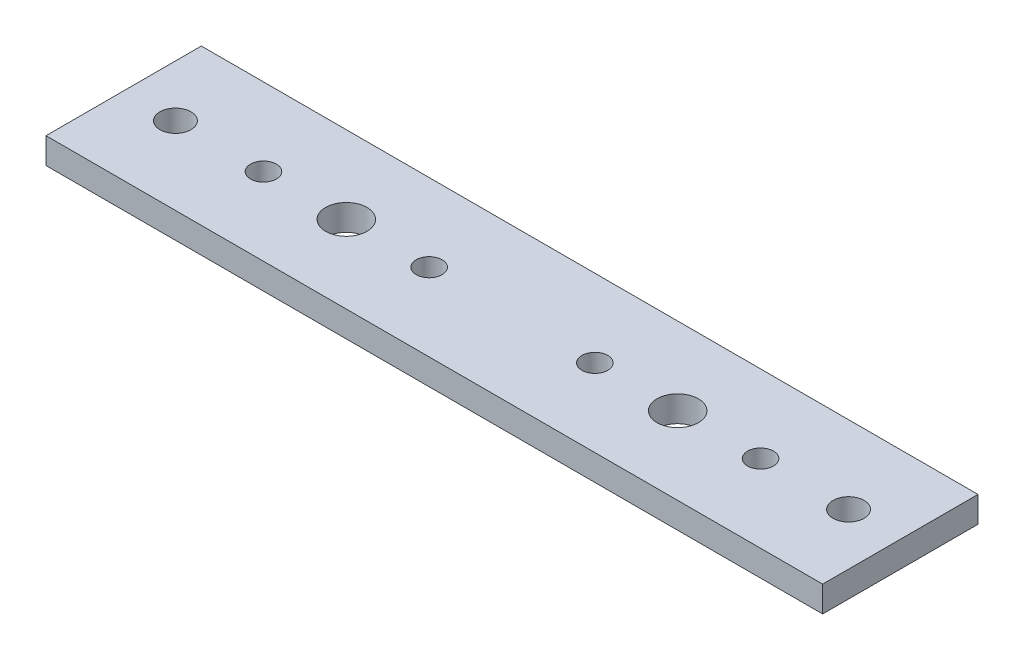
ISO-10303-21;
HEADER;
FILE_DESCRIPTION(('STEP AP214'),'2;1');
FILE_NAME('part.step','',(''),(''),'','','');
FILE_SCHEMA(('AUTOMOTIVE_DESIGN { 1 0 10303 214 1 1 1 1 }'));
ENDSEC;
DATA;
#1=APPLICATION_CONTEXT('core data for automotive mechanical design processes');
#2=APPLICATION_PROTOCOL_DEFINITION('international standard','automotive_design',2000,#1);
#3=PRODUCT_CONTEXT('',#1,'mechanical');
#4=PRODUCT('Part','Part','',(#3));
#5=PRODUCT_RELATED_PRODUCT_CATEGORY('part','',(#4));
#6=PRODUCT_DEFINITION_FORMATION('','',#4);
#7=PRODUCT_DEFINITION_CONTEXT('part definition',#1,'design');
#8=PRODUCT_DEFINITION('design','',#6,#7);
#9=PRODUCT_DEFINITION_SHAPE('','',#8);
#10=(LENGTH_UNIT() NAMED_UNIT(*) SI_UNIT(.MILLI.,.METRE.));
#11=(NAMED_UNIT(*) PLANE_ANGLE_UNIT() SI_UNIT($,.RADIAN.));
#12=(NAMED_UNIT(*) SI_UNIT($,.STERADIAN.) SOLID_ANGLE_UNIT());
#13=UNCERTAINTY_MEASURE_WITH_UNIT(LENGTH_MEASURE(1.E-05),#10,'distance_accuracy_value','');
#14=(GEOMETRIC_REPRESENTATION_CONTEXT(3) GLOBAL_UNCERTAINTY_ASSIGNED_CONTEXT((#13)) GLOBAL_UNIT_ASSIGNED_CONTEXT((#10,
#11,#12)) REPRESENTATION_CONTEXT('',''));
#15=CARTESIAN_POINT('',(0.,0.,0.));
#16=DIRECTION('',(0.,0.,1.));
#17=DIRECTION('',(1.,0.,0.));
#18=AXIS2_PLACEMENT_3D('',#15,#16,#17);
#19=CARTESIAN_POINT('',(0.,5.,0.));
#20=DIRECTION('',(0.,1.,0.));
#21=DIRECTION('',(0.,0.,1.));
#22=AXIS2_PLACEMENT_3D('',#19,#20,#21);
#23=PLANE('',#22);
#24=CARTESIAN_POINT('',(13.0686224444305,5.,-26.2271286165447));
#25=DIRECTION('',(0.,1.,0.));
#26=DIRECTION('',(0.,0.,-1.));
#27=AXIS2_PLACEMENT_3D('',#24,#25,#26);
#28=CIRCLE('',#27,4.);
#29=CARTESIAN_POINT('',(13.0686224444305,5.,-30.2271286165447));
#30=VERTEX_POINT('',#29);
#31=EDGE_CURVE('E145',#30,#30,#28,.T.);
#32=ORIENTED_EDGE('',*,*,#31,.F.);
#33=EDGE_LOOP('',(#32));
#34=FACE_BOUND('',#33,.T.);
#35=CARTESIAN_POINT('',(-66.9313775555696,5.,-26.2271286165446));
#36=DIRECTION('',(0.,1.,0.));
#37=DIRECTION('',(0.,0.,1.));
#38=AXIS2_PLACEMENT_3D('',#35,#36,#37);
#39=CIRCLE('',#38,2.5);
#40=CARTESIAN_POINT('',(-66.9313775555696,5.,-23.7271286165447));
#41=VERTEX_POINT('',#40);
#42=EDGE_CURVE('E133',#41,#41,#39,.T.);
#43=ORIENTED_EDGE('',*,*,#42,.F.);
#44=EDGE_LOOP('',(#43));
#45=FACE_BOUND('',#44,.T.);
#46=CARTESIAN_POINT('',(-50.9313775555695,5.,-26.2271286165446));
#47=DIRECTION('',(0.,1.,0.));
#48=DIRECTION('',(0.,0.,1.));
#49=AXIS2_PLACEMENT_3D('',#46,#47,#48);
#50=CIRCLE('',#49,4.00000000000001);
#51=CARTESIAN_POINT('',(-50.9313775555695,5.,-22.2271286165446));
#52=VERTEX_POINT('',#51);
#53=EDGE_CURVE('E121',#52,#52,#50,.T.);
#54=ORIENTED_EDGE('',*,*,#53,.F.);
#55=EDGE_LOOP('',(#54));
#56=FACE_BOUND('',#55,.T.);
#57=CARTESIAN_POINT('',(-83.9313775555696,5.,-26.2271286165446));
#58=DIRECTION('',(0.,1.,0.));
#59=DIRECTION('',(0.,0.,1.));
#60=AXIS2_PLACEMENT_3D('',#57,#58,#59);
#61=CIRCLE('',#60,3.00000000000001);
#62=CARTESIAN_POINT('',(-83.9313775555696,5.,-23.2271286165446));
#63=VERTEX_POINT('',#62);
#64=EDGE_CURVE('E100',#63,#63,#61,.T.);
#65=ORIENTED_EDGE('',*,*,#64,.F.);
#66=EDGE_LOOP('',(#65));
#67=FACE_BOUND('',#66,.T.);
#68=DIRECTION('',(0.,0.,1.));
#69=VECTOR('',#68,1.);
#70=CARTESIAN_POINT('',(-93.9313775555695,5.,-41.2271286165446));
#71=LINE('',#70,#69);
#72=CARTESIAN_POINT('',(-93.9313775555695,5.,-41.2271286165446));
#73=VERTEX_POINT('',#72);
#74=CARTESIAN_POINT('',(-93.9313775555695,5.,-11.2271286165446));
#75=VERTEX_POINT('',#74);
#76=EDGE_CURVE('E85',#73,#75,#71,.T.);
#77=ORIENTED_EDGE('',*,*,#76,.T.);
#78=DIRECTION('',(1.,0.,0.));
#79=VECTOR('',#78,1.);
#80=CARTESIAN_POINT('',(-93.9313775555695,5.,-11.2271286165446));
#81=LINE('',#80,#79);
#82=CARTESIAN_POINT('',(56.0686224444305,5.,-11.2271286165446));
#83=VERTEX_POINT('',#82);
#84=EDGE_CURVE('E80',#75,#83,#81,.T.);
#85=ORIENTED_EDGE('',*,*,#84,.T.);
#86=DIRECTION('',(0.,0.,-1.));
#87=VECTOR('',#86,1.);
#88=CARTESIAN_POINT('',(56.0686224444304,5.,-41.2271286165446));
#89=LINE('',#88,#87);
#90=CARTESIAN_POINT('',(56.0686224444304,5.,-41.2271286165446));
#91=VERTEX_POINT('',#90);
#92=EDGE_CURVE('E83',#83,#91,#89,.T.);
#93=ORIENTED_EDGE('',*,*,#92,.T.);
#94=DIRECTION('',(-1.,0.,0.));
#95=VECTOR('',#94,1.);
#96=CARTESIAN_POINT('',(-93.9313775555695,5.,-41.2271286165446));
#97=LINE('',#96,#95);
#98=EDGE_CURVE('E50',#91,#73,#97,.T.);
#99=ORIENTED_EDGE('',*,*,#98,.T.);
#100=EDGE_LOOP('',(#77,#85,#93,#99));
#101=FACE_BOUND('',#100,.T.);
#102=CARTESIAN_POINT('',(46.0686224444305,5.,-26.2271286165447));
#103=DIRECTION('',(0.,1.,0.));
#104=DIRECTION('',(0.,0.,-1.));
#105=AXIS2_PLACEMENT_3D('',#102,#103,#104);
#106=CIRCLE('',#105,2.99999999999999);
#107=CARTESIAN_POINT('',(46.0686224444305,5.,-29.2271286165447));
#108=VERTEX_POINT('',#107);
#109=EDGE_CURVE('E115',#108,#108,#106,.T.);
#110=ORIENTED_EDGE('',*,*,#109,.F.);
#111=EDGE_LOOP('',(#110));
#112=FACE_BOUND('',#111,.T.);
#113=CARTESIAN_POINT('',(-34.9313775555695,5.,-26.2271286165446));
#114=DIRECTION('',(0.,1.,0.));
#115=DIRECTION('',(0.,0.,1.));
#116=AXIS2_PLACEMENT_3D('',#113,#114,#115);
#117=CIRCLE('',#116,2.5);
#118=CARTESIAN_POINT('',(-34.9313775555695,5.,-23.7271286165446));
#119=VERTEX_POINT('',#118);
#120=EDGE_CURVE('E127',#119,#119,#117,.T.);
#121=ORIENTED_EDGE('',*,*,#120,.F.);
#122=EDGE_LOOP('',(#121));
#123=FACE_BOUND('',#122,.T.);
#124=CARTESIAN_POINT('',(-2.93137755556954,5.,-26.2271286165447));
#125=DIRECTION('',(0.,1.,0.));
#126=DIRECTION('',(0.,0.,-1.));
#127=AXIS2_PLACEMENT_3D('',#124,#125,#126);
#128=CIRCLE('',#127,2.5);
#129=CARTESIAN_POINT('',(-2.93137755556954,5.,-28.7271286165447));
#130=VERTEX_POINT('',#129);
#131=EDGE_CURVE('E139',#130,#130,#128,.T.);
#132=ORIENTED_EDGE('',*,*,#131,.F.);
#133=EDGE_LOOP('',(#132));
#134=FACE_BOUND('',#133,.T.);
#135=CARTESIAN_POINT('',(29.0686224444305,5.,-26.2271286165447));
#136=DIRECTION('',(0.,1.,0.));
#137=DIRECTION('',(0.,0.,-1.));
#138=AXIS2_PLACEMENT_3D('',#135,#136,#137);
#139=CIRCLE('',#138,2.49999999999999);
#140=CARTESIAN_POINT('',(29.0686224444305,5.,-28.7271286165447));
#141=VERTEX_POINT('',#140);
#142=EDGE_CURVE('E151',#141,#141,#139,.T.);
#143=ORIENTED_EDGE('',*,*,#142,.F.);
#144=EDGE_LOOP('',(#143));
#145=FACE_BOUND('',#144,.T.);
#146=ADVANCED_FACE('F33',(#34,#45,#56,#67,#101,#112,#123,#134,#145),#23,.T.);
#147=CARTESIAN_POINT('',(0.,0.,0.));
#148=DIRECTION('',(0.,1.,0.));
#149=DIRECTION('',(0.,0.,1.));
#150=AXIS2_PLACEMENT_3D('',#147,#148,#149);
#151=PLANE('',#150);
#152=DIRECTION('',(0.,0.,1.));
#153=VECTOR('',#152,1.);
#154=CARTESIAN_POINT('',(-93.9313775555695,0.,-41.2271286165446));
#155=LINE('',#154,#153);
#156=CARTESIAN_POINT('',(-93.9313775555695,0.,-41.2271286165446));
#157=VERTEX_POINT('',#156);
#158=CARTESIAN_POINT('',(-93.9313775555695,0.,-11.2271286165446));
#159=VERTEX_POINT('',#158);
#160=EDGE_CURVE('E97',#157,#159,#155,.T.);
#161=ORIENTED_EDGE('',*,*,#160,.F.);
#162=DIRECTION('',(-1.,0.,0.));
#163=VECTOR('',#162,1.);
#164=CARTESIAN_POINT('',(-93.9313775555695,0.,-41.2271286165446));
#165=LINE('',#164,#163);
#166=CARTESIAN_POINT('',(56.0686224444304,0.,-41.2271286165446));
#167=VERTEX_POINT('',#166);
#168=EDGE_CURVE('E73',#167,#157,#165,.T.);
#169=ORIENTED_EDGE('',*,*,#168,.F.);
#170=DIRECTION('',(0.,0.,-1.));
#171=VECTOR('',#170,1.);
#172=CARTESIAN_POINT('',(56.0686224444304,0.,-41.2271286165446));
#173=LINE('',#172,#171);
#174=CARTESIAN_POINT('',(56.0686224444305,0.,-11.2271286165446));
#175=VERTEX_POINT('',#174);
#176=EDGE_CURVE('E67',#175,#167,#173,.T.);
#177=ORIENTED_EDGE('',*,*,#176,.F.);
#178=DIRECTION('',(1.,0.,0.));
#179=VECTOR('',#178,1.);
#180=CARTESIAN_POINT('',(-93.9313775555695,0.,-11.2271286165446));
#181=LINE('',#180,#179);
#182=EDGE_CURVE('E89',#159,#175,#181,.T.);
#183=ORIENTED_EDGE('',*,*,#182,.F.);
#184=EDGE_LOOP('',(#161,#169,#177,#183));
#185=FACE_BOUND('',#184,.T.);
#186=CARTESIAN_POINT('',(-83.9313775555696,0.,-26.2271286165446));
#187=DIRECTION('',(0.,1.,0.));
#188=DIRECTION('',(0.,0.,1.));
#189=AXIS2_PLACEMENT_3D('',#186,#187,#188);
#190=CIRCLE('',#189,3.00000000000001);
#191=CARTESIAN_POINT('',(-83.9313775555696,0.,-23.2271286165446));
#192=VERTEX_POINT('',#191);
#193=EDGE_CURVE('E112',#192,#192,#190,.T.);
#194=ORIENTED_EDGE('',*,*,#193,.T.);
#195=EDGE_LOOP('',(#194));
#196=FACE_BOUND('',#195,.T.);
#197=CARTESIAN_POINT('',(46.0686224444305,0.,-26.2271286165447));
#198=DIRECTION('',(0.,1.,0.));
#199=DIRECTION('',(0.,0.,-1.));
#200=AXIS2_PLACEMENT_3D('',#197,#198,#199);
#201=CIRCLE('',#200,2.99999999999999);
#202=CARTESIAN_POINT('',(46.0686224444305,0.,-29.2271286165447));
#203=VERTEX_POINT('',#202);
#204=EDGE_CURVE('E118',#203,#203,#201,.T.);
#205=ORIENTED_EDGE('',*,*,#204,.T.);
#206=EDGE_LOOP('',(#205));
#207=FACE_BOUND('',#206,.T.);
#208=CARTESIAN_POINT('',(-50.9313775555695,0.,-26.2271286165446));
#209=DIRECTION('',(0.,1.,0.));
#210=DIRECTION('',(0.,0.,1.));
#211=AXIS2_PLACEMENT_3D('',#208,#209,#210);
#212=CIRCLE('',#211,4.00000000000001);
#213=CARTESIAN_POINT('',(-50.9313775555695,0.,-22.2271286165446));
#214=VERTEX_POINT('',#213);
#215=EDGE_CURVE('E124',#214,#214,#212,.T.);
#216=ORIENTED_EDGE('',*,*,#215,.T.);
#217=EDGE_LOOP('',(#216));
#218=FACE_BOUND('',#217,.T.);
#219=CARTESIAN_POINT('',(-34.9313775555695,0.,-26.2271286165446));
#220=DIRECTION('',(0.,1.,0.));
#221=DIRECTION('',(0.,0.,1.));
#222=AXIS2_PLACEMENT_3D('',#219,#220,#221);
#223=CIRCLE('',#222,2.5);
#224=CARTESIAN_POINT('',(-34.9313775555695,0.,-23.7271286165446));
#225=VERTEX_POINT('',#224);
#226=EDGE_CURVE('E130',#225,#225,#223,.T.);
#227=ORIENTED_EDGE('',*,*,#226,.T.);
#228=EDGE_LOOP('',(#227));
#229=FACE_BOUND('',#228,.T.);
#230=CARTESIAN_POINT('',(-66.9313775555696,0.,-26.2271286165446));
#231=DIRECTION('',(0.,1.,0.));
#232=DIRECTION('',(0.,0.,1.));
#233=AXIS2_PLACEMENT_3D('',#230,#231,#232);
#234=CIRCLE('',#233,2.5);
#235=CARTESIAN_POINT('',(-66.9313775555696,0.,-23.7271286165447));
#236=VERTEX_POINT('',#235);
#237=EDGE_CURVE('E136',#236,#236,#234,.T.);
#238=ORIENTED_EDGE('',*,*,#237,.T.);
#239=EDGE_LOOP('',(#238));
#240=FACE_BOUND('',#239,.T.);
#241=CARTESIAN_POINT('',(-2.93137755556954,0.,-26.2271286165447));
#242=DIRECTION('',(0.,1.,0.));
#243=DIRECTION('',(0.,0.,-1.));
#244=AXIS2_PLACEMENT_3D('',#241,#242,#243);
#245=CIRCLE('',#244,2.5);
#246=CARTESIAN_POINT('',(-2.93137755556954,0.,-28.7271286165447));
#247=VERTEX_POINT('',#246);
#248=EDGE_CURVE('E142',#247,#247,#245,.T.);
#249=ORIENTED_EDGE('',*,*,#248,.T.);
#250=EDGE_LOOP('',(#249));
#251=FACE_BOUND('',#250,.T.);
#252=CARTESIAN_POINT('',(13.0686224444305,0.,-26.2271286165447));
#253=DIRECTION('',(0.,1.,0.));
#254=DIRECTION('',(0.,0.,-1.));
#255=AXIS2_PLACEMENT_3D('',#252,#253,#254);
#256=CIRCLE('',#255,4.);
#257=CARTESIAN_POINT('',(13.0686224444305,0.,-30.2271286165447));
#258=VERTEX_POINT('',#257);
#259=EDGE_CURVE('E148',#258,#258,#256,.T.);
#260=ORIENTED_EDGE('',*,*,#259,.T.);
#261=EDGE_LOOP('',(#260));
#262=FACE_BOUND('',#261,.T.);
#263=CARTESIAN_POINT('',(29.0686224444305,0.,-26.2271286165447));
#264=DIRECTION('',(0.,1.,0.));
#265=DIRECTION('',(0.,0.,-1.));
#266=AXIS2_PLACEMENT_3D('',#263,#264,#265);
#267=CIRCLE('',#266,2.49999999999999);
#268=CARTESIAN_POINT('',(29.0686224444305,0.,-28.7271286165447));
#269=VERTEX_POINT('',#268);
#270=EDGE_CURVE('E154',#269,#269,#267,.T.);
#271=ORIENTED_EDGE('',*,*,#270,.T.);
#272=EDGE_LOOP('',(#271));
#273=FACE_BOUND('',#272,.T.);
#274=ADVANCED_FACE('F108',(#185,#196,#207,#218,#229,#240,#251,#262,#273),#151,.F.);
#275=CARTESIAN_POINT('',(-93.9313775555695,5.,-41.2271286165446));
#276=DIRECTION('',(1.,0.,0.));
#277=DIRECTION('',(0.,0.,-1.));
#278=AXIS2_PLACEMENT_3D('',#275,#276,#277);
#279=PLANE('',#278);
#280=ORIENTED_EDGE('',*,*,#160,.T.);
#281=DIRECTION('',(0.,-1.,0.));
#282=VECTOR('',#281,1.);
#283=CARTESIAN_POINT('',(-93.9313775555695,5.,-11.2271286165446));
#284=LINE('',#283,#282);
#285=EDGE_CURVE('E11',#75,#159,#284,.T.);
#286=ORIENTED_EDGE('',*,*,#285,.F.);
#287=ORIENTED_EDGE('',*,*,#76,.F.);
#288=DIRECTION('',(0.,-1.,0.));
#289=VECTOR('',#288,1.);
#290=CARTESIAN_POINT('',(-93.9313775555695,5.,-41.2271286165446));
#291=LINE('',#290,#289);
#292=EDGE_CURVE('E93',#73,#157,#291,.T.);
#293=ORIENTED_EDGE('',*,*,#292,.T.);
#294=EDGE_LOOP('',(#280,#286,#287,#293));
#295=FACE_BOUND('',#294,.T.);
#296=ADVANCED_FACE('F35',(#295),#279,.F.);
#297=CARTESIAN_POINT('',(-93.9313775555695,5.,-11.2271286165446));
#298=DIRECTION('',(0.,0.,-1.));
#299=DIRECTION('',(-1.,0.,0.));
#300=AXIS2_PLACEMENT_3D('',#297,#298,#299);
#301=PLANE('',#300);
#302=ORIENTED_EDGE('',*,*,#182,.T.);
#303=DIRECTION('',(0.,-1.,0.));
#304=VECTOR('',#303,1.);
#305=CARTESIAN_POINT('',(56.0686224444305,5.,-11.2271286165446));
#306=LINE('',#305,#304);
#307=EDGE_CURVE('E42',#83,#175,#306,.T.);
#308=ORIENTED_EDGE('',*,*,#307,.F.);
#309=ORIENTED_EDGE('',*,*,#84,.F.);
#310=ORIENTED_EDGE('',*,*,#285,.T.);
#311=EDGE_LOOP('',(#302,#308,#309,#310));
#312=FACE_BOUND('',#311,.T.);
#313=ADVANCED_FACE('F88',(#312),#301,.F.);
#314=CARTESIAN_POINT('',(56.0686224444304,5.,-41.2271286165446));
#315=DIRECTION('',(-1.,0.,0.));
#316=DIRECTION('',(0.,0.,1.));
#317=AXIS2_PLACEMENT_3D('',#314,#315,#316);
#318=PLANE('',#317);
#319=ORIENTED_EDGE('',*,*,#176,.T.);
#320=DIRECTION('',(0.,-1.,0.));
#321=VECTOR('',#320,1.);
#322=CARTESIAN_POINT('',(56.0686224444304,5.,-41.2271286165446));
#323=LINE('',#322,#321);
#324=EDGE_CURVE('E90',#91,#167,#323,.T.);
#325=ORIENTED_EDGE('',*,*,#324,.F.);
#326=ORIENTED_EDGE('',*,*,#92,.F.);
#327=ORIENTED_EDGE('',*,*,#307,.T.);
#328=EDGE_LOOP('',(#319,#325,#326,#327));
#329=FACE_BOUND('',#328,.T.);
#330=ADVANCED_FACE('F91',(#329),#318,.F.);
#331=CARTESIAN_POINT('',(-93.9313775555695,5.,-41.2271286165446));
#332=DIRECTION('',(0.,0.,1.));
#333=DIRECTION('',(1.,0.,0.));
#334=AXIS2_PLACEMENT_3D('',#331,#332,#333);
#335=PLANE('',#334);
#336=ORIENTED_EDGE('',*,*,#168,.T.);
#337=ORIENTED_EDGE('',*,*,#292,.F.);
#338=ORIENTED_EDGE('',*,*,#98,.F.);
#339=ORIENTED_EDGE('',*,*,#324,.T.);
#340=EDGE_LOOP('',(#336,#337,#338,#339));
#341=FACE_BOUND('',#340,.T.);
#342=ADVANCED_FACE('F105',(#341),#335,.F.);
#343=CARTESIAN_POINT('',(-83.9313775555696,5.,-26.2271286165446));
#344=DIRECTION('',(0.,-1.,0.));
#345=DIRECTION('',(0.,0.,-1.));
#346=AXIS2_PLACEMENT_3D('',#343,#344,#345);
#347=CYLINDRICAL_SURFACE('',#346,3.00000000000001);
#348=ORIENTED_EDGE('',*,*,#64,.T.);
#349=EDGE_LOOP('',(#348));
#350=FACE_BOUND('',#349,.T.);
#351=ORIENTED_EDGE('',*,*,#193,.F.);
#352=EDGE_LOOP('',(#351));
#353=FACE_BOUND('',#352,.T.);
#354=ADVANCED_FACE('F173',(#350,#353),#347,.F.);
#355=CARTESIAN_POINT('',(46.0686224444305,5.,-26.2271286165447));
#356=DIRECTION('',(0.,-1.,0.));
#357=DIRECTION('',(0.,0.,-1.));
#358=AXIS2_PLACEMENT_3D('',#355,#356,#357);
#359=CYLINDRICAL_SURFACE('',#358,2.99999999999999);
#360=ORIENTED_EDGE('',*,*,#109,.T.);
#361=EDGE_LOOP('',(#360));
#362=FACE_BOUND('',#361,.T.);
#363=ORIENTED_EDGE('',*,*,#204,.F.);
#364=EDGE_LOOP('',(#363));
#365=FACE_BOUND('',#364,.T.);
#366=ADVANCED_FACE('F219',(#362,#365),#359,.F.);
#367=CARTESIAN_POINT('',(-50.9313775555695,5.,-26.2271286165446));
#368=DIRECTION('',(0.,-1.,0.));
#369=DIRECTION('',(0.,0.,-1.));
#370=AXIS2_PLACEMENT_3D('',#367,#368,#369);
#371=CYLINDRICAL_SURFACE('',#370,4.00000000000001);
#372=ORIENTED_EDGE('',*,*,#53,.T.);
#373=EDGE_LOOP('',(#372));
#374=FACE_BOUND('',#373,.T.);
#375=ORIENTED_EDGE('',*,*,#215,.F.);
#376=EDGE_LOOP('',(#375));
#377=FACE_BOUND('',#376,.T.);
#378=ADVANCED_FACE('F227',(#374,#377),#371,.F.);
#379=CARTESIAN_POINT('',(-34.9313775555695,5.,-26.2271286165446));
#380=DIRECTION('',(0.,-1.,0.));
#381=DIRECTION('',(0.,0.,-1.));
#382=AXIS2_PLACEMENT_3D('',#379,#380,#381);
#383=CYLINDRICAL_SURFACE('',#382,2.5);
#384=ORIENTED_EDGE('',*,*,#120,.T.);
#385=EDGE_LOOP('',(#384));
#386=FACE_BOUND('',#385,.T.);
#387=ORIENTED_EDGE('',*,*,#226,.F.);
#388=EDGE_LOOP('',(#387));
#389=FACE_BOUND('',#388,.T.);
#390=ADVANCED_FACE('F235',(#386,#389),#383,.F.);
#391=CARTESIAN_POINT('',(-66.9313775555696,5.,-26.2271286165446));
#392=DIRECTION('',(0.,-1.,0.));
#393=DIRECTION('',(0.,0.,-1.));
#394=AXIS2_PLACEMENT_3D('',#391,#392,#393);
#395=CYLINDRICAL_SURFACE('',#394,2.5);
#396=ORIENTED_EDGE('',*,*,#42,.T.);
#397=EDGE_LOOP('',(#396));
#398=FACE_BOUND('',#397,.T.);
#399=ORIENTED_EDGE('',*,*,#237,.F.);
#400=EDGE_LOOP('',(#399));
#401=FACE_BOUND('',#400,.T.);
#402=ADVANCED_FACE('F244',(#398,#401),#395,.F.);
#403=CARTESIAN_POINT('',(-2.93137755556954,5.,-26.2271286165447));
#404=DIRECTION('',(0.,-1.,0.));
#405=DIRECTION('',(0.,0.,-1.));
#406=AXIS2_PLACEMENT_3D('',#403,#404,#405);
#407=CYLINDRICAL_SURFACE('',#406,2.5);
#408=ORIENTED_EDGE('',*,*,#131,.T.);
#409=EDGE_LOOP('',(#408));
#410=FACE_BOUND('',#409,.T.);
#411=ORIENTED_EDGE('',*,*,#248,.F.);
#412=EDGE_LOOP('',(#411));
#413=FACE_BOUND('',#412,.T.);
#414=ADVANCED_FACE('F253',(#410,#413),#407,.F.);
#415=CARTESIAN_POINT('',(13.0686224444305,5.,-26.2271286165447));
#416=DIRECTION('',(0.,-1.,0.));
#417=DIRECTION('',(0.,0.,-1.));
#418=AXIS2_PLACEMENT_3D('',#415,#416,#417);
#419=CYLINDRICAL_SURFACE('',#418,4.);
#420=ORIENTED_EDGE('',*,*,#31,.T.);
#421=EDGE_LOOP('',(#420));
#422=FACE_BOUND('',#421,.T.);
#423=ORIENTED_EDGE('',*,*,#259,.F.);
#424=EDGE_LOOP('',(#423));
#425=FACE_BOUND('',#424,.T.);
#426=ADVANCED_FACE('F262',(#422,#425),#419,.F.);
#427=CARTESIAN_POINT('',(29.0686224444305,5.,-26.2271286165447));
#428=DIRECTION('',(0.,-1.,0.));
#429=DIRECTION('',(0.,0.,-1.));
#430=AXIS2_PLACEMENT_3D('',#427,#428,#429);
#431=CYLINDRICAL_SURFACE('',#430,2.49999999999999);
#432=ORIENTED_EDGE('',*,*,#142,.T.);
#433=EDGE_LOOP('',(#432));
#434=FACE_BOUND('',#433,.T.);
#435=ORIENTED_EDGE('',*,*,#270,.F.);
#436=EDGE_LOOP('',(#435));
#437=FACE_BOUND('',#436,.T.);
#438=ADVANCED_FACE('F160',(#434,#437),#431,.F.);
#439=CLOSED_SHELL('',(#146,#274,#296,#313,#330,#342,#354,#366,#378,#390,#402,#414,#426,#438));
#440=MANIFOLD_SOLID_BREP('B2',#439);
#441=ADVANCED_BREP_SHAPE_REPRESENTATION('',(#18,#440),#14);
#442=SHAPE_DEFINITION_REPRESENTATION(#9,#441);
ENDSEC;
END-ISO-10303-21;
